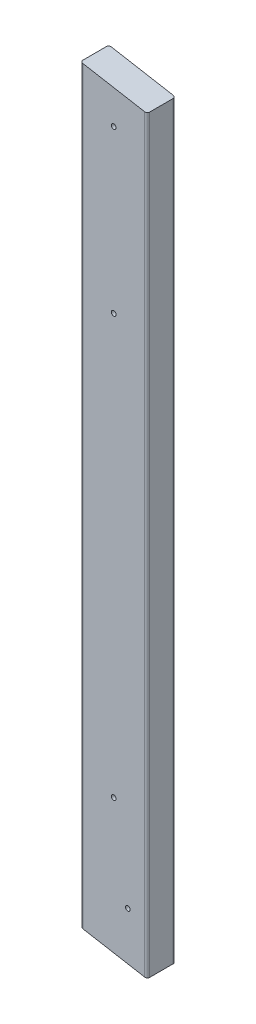
ISO-10303-21;
HEADER;
FILE_DESCRIPTION(('STEP AP214'),'2;1');
FILE_NAME('part.step','',(''),(''),'','','');
FILE_SCHEMA(('AUTOMOTIVE_DESIGN { 1 0 10303 214 1 1 1 1 }'));
ENDSEC;
DATA;
#1=APPLICATION_CONTEXT('core data for automotive mechanical design processes');
#2=APPLICATION_PROTOCOL_DEFINITION('international standard','automotive_design',2000,#1);
#3=PRODUCT_CONTEXT('',#1,'mechanical');
#4=PRODUCT('Part','Part','',(#3));
#5=PRODUCT_RELATED_PRODUCT_CATEGORY('part','',(#4));
#6=PRODUCT_DEFINITION_FORMATION('','',#4);
#7=PRODUCT_DEFINITION_CONTEXT('part definition',#1,'design');
#8=PRODUCT_DEFINITION('design','',#6,#7);
#9=PRODUCT_DEFINITION_SHAPE('','',#8);
#10=(LENGTH_UNIT() NAMED_UNIT(*) SI_UNIT(.MILLI.,.METRE.));
#11=(NAMED_UNIT(*) PLANE_ANGLE_UNIT() SI_UNIT($,.RADIAN.));
#12=(NAMED_UNIT(*) SI_UNIT($,.STERADIAN.) SOLID_ANGLE_UNIT());
#13=UNCERTAINTY_MEASURE_WITH_UNIT(LENGTH_MEASURE(1.E-05),#10,'distance_accuracy_value','');
#14=(GEOMETRIC_REPRESENTATION_CONTEXT(3) GLOBAL_UNCERTAINTY_ASSIGNED_CONTEXT((#13)) GLOBAL_UNIT_ASSIGNED_CONTEXT((#10,
#11,#12)) REPRESENTATION_CONTEXT('',''));
#15=CARTESIAN_POINT('',(0.,0.,0.));
#16=DIRECTION('',(0.,0.,1.));
#17=DIRECTION('',(1.,0.,0.));
#18=AXIS2_PLACEMENT_3D('',#15,#16,#17);
#19=CARTESIAN_POINT('',(-44.4500000000001,1016.,-19.05));
#20=DIRECTION('',(1.,0.,0.));
#21=DIRECTION('',(0.,0.,-0.999999999999999));
#22=AXIS2_PLACEMENT_3D('',#19,#20,#21);
#23=PLANE('',#22);
#24=DIRECTION('',(0.,0.,0.999999999999999));
#25=VECTOR('',#24,1.);
#26=CARTESIAN_POINT('',(-44.4500000000001,1016.,-19.05));
#27=LINE('',#26,#25);
#28=CARTESIAN_POINT('',(-44.4500000000001,1016.,-15.8749999999999));
#29=VERTEX_POINT('',#28);
#30=CARTESIAN_POINT('',(-44.4500000000001,1016.,15.8749999999999));
#31=VERTEX_POINT('',#30);
#32=EDGE_CURVE('E142',#29,#31,#27,.T.);
#33=ORIENTED_EDGE('',*,*,#32,.F.);
#34=DIRECTION('',(0.,-1.,0.));
#35=VECTOR('',#34,1.);
#36=CARTESIAN_POINT('',(-44.4500000000001,1016.,-15.8749999999999));
#37=LINE('',#36,#35);
#38=CARTESIAN_POINT('',(-44.4500000000012,15.6754685849817,-15.8749999999999));
#39=VERTEX_POINT('',#38);
#40=EDGE_CURVE('E11',#29,#39,#37,.T.);
#41=ORIENTED_EDGE('',*,*,#40,.T.);
#42=DIRECTION('',(0.,0.,0.999999999999999));
#43=VECTOR('',#42,1.);
#44=CARTESIAN_POINT('',(-44.4500000000012,15.6754685849816,-19.05));
#45=LINE('',#44,#43);
#46=CARTESIAN_POINT('',(-44.450000000001,15.6754685849817,15.8749999999999));
#47=VERTEX_POINT('',#46);
#48=EDGE_CURVE('E124',#39,#47,#45,.T.);
#49=ORIENTED_EDGE('',*,*,#48,.T.);
#50=DIRECTION('',(0.,-1.,0.));
#51=VECTOR('',#50,1.);
#52=CARTESIAN_POINT('',(-44.4500000000001,1016.,15.8749999999999));
#53=LINE('',#52,#51);
#54=EDGE_CURVE('E40',#47,#31,#53,.F.);
#55=ORIENTED_EDGE('',*,*,#54,.T.);
#56=EDGE_LOOP('',(#33,#41,#49,#55));
#57=FACE_BOUND('',#56,.T.);
#58=ADVANCED_FACE('F32',(#57),#23,.F.);
#59=CARTESIAN_POINT('',(44.449999999999,1016.,19.05));
#60=DIRECTION('',(0.,0.,-0.999999999999999));
#61=DIRECTION('',(-1.,0.,0.));
#62=AXIS2_PLACEMENT_3D('',#59,#60,#61);
#63=PLANE('',#62);
#64=CARTESIAN_POINT('',(18.7869687794762,68.7375857646206,19.05));
#65=DIRECTION('',(0.,0.,0.999999999999999));
#66=DIRECTION('',(1.,0.,0.));
#67=AXIS2_PLACEMENT_3D('',#64,#65,#66);
#68=CIRCLE('',#67,3.17499999999999);
#69=CARTESIAN_POINT('',(21.9619687794762,68.7375857646206,19.05));
#70=VERTEX_POINT('',#69);
#71=EDGE_CURVE('E330',#70,#70,#68,.T.);
#72=ORIENTED_EDGE('',*,*,#71,.F.);
#73=EDGE_LOOP('',(#72));
#74=FACE_BOUND('',#73,.T.);
#75=CARTESIAN_POINT('',(-4.44089209850063E-13,187.400991466,19.0500000000009));
#76=DIRECTION('',(0.,0.,0.999999999999999));
#77=DIRECTION('',(1.,0.,0.));
#78=AXIS2_PLACEMENT_3D('',#75,#76,#77);
#79=CIRCLE('',#78,3.17499999999999);
#80=CARTESIAN_POINT('',(3.17499999999955,187.400991466,19.0500000000009));
#81=VERTEX_POINT('',#80);
#82=EDGE_CURVE('E326',#81,#81,#79,.T.);
#83=ORIENTED_EDGE('',*,*,#82,.F.);
#84=EDGE_LOOP('',(#83));
#85=FACE_BOUND('',#84,.T.);
#86=CARTESIAN_POINT('',(-8.88178419700125E-13,747.126552809187,19.05));
#87=DIRECTION('',(0.,0.,0.999999999999999));
#88=DIRECTION('',(1.,0.,0.));
#89=AXIS2_PLACEMENT_3D('',#86,#87,#88);
#90=CIRCLE('',#89,3.17499999999999);
#91=CARTESIAN_POINT('',(3.1749999999991,747.126552809187,19.05));
#92=VERTEX_POINT('',#91);
#93=EDGE_CURVE('E320',#92,#92,#90,.T.);
#94=ORIENTED_EDGE('',*,*,#93,.F.);
#95=EDGE_LOOP('',(#94));
#96=FACE_BOUND('',#95,.T.);
#97=CARTESIAN_POINT('',(-2.22044604925031E-13,963.026552809188,19.05));
#98=DIRECTION('',(0.,0.,0.999999999999999));
#99=DIRECTION('',(1.,0.,0.));
#100=AXIS2_PLACEMENT_3D('',#97,#98,#99);
#101=CIRCLE('',#100,3.17499999999999);
#102=CARTESIAN_POINT('',(3.17499999999977,963.026552809188,19.05));
#103=VERTEX_POINT('',#102);
#104=EDGE_CURVE('E316',#103,#103,#101,.T.);
#105=ORIENTED_EDGE('',*,*,#104,.F.);
#106=EDGE_LOOP('',(#105));
#107=FACE_BOUND('',#106,.T.);
#108=DIRECTION('',(-0.98480775301221,0.173648177666924,0.));
#109=VECTOR('',#108,1.);
#110=CARTESIAN_POINT('',(-44.450000000001,15.6754685849817,19.05));
#111=LINE('',#110,#109);
#112=CARTESIAN_POINT('',(41.2749999999988,0.55983816374916,19.05));
#113=VERTEX_POINT('',#112);
#114=CARTESIAN_POINT('',(-41.2750000000004,15.1156304212324,19.05));
#115=VERTEX_POINT('',#114);
#116=EDGE_CURVE('E125',#113,#115,#111,.T.);
#117=ORIENTED_EDGE('',*,*,#116,.F.);
#118=DIRECTION('',(0.,-1.,0.));
#119=VECTOR('',#118,1.);
#120=CARTESIAN_POINT('',(41.2749999999999,1016.,19.05));
#121=LINE('',#120,#119);
#122=CARTESIAN_POINT('',(41.2749999999988,1000.88436957877,19.05));
#123=VERTEX_POINT('',#122);
#124=EDGE_CURVE('E162',#113,#123,#121,.F.);
#125=ORIENTED_EDGE('',*,*,#124,.T.);
#126=DIRECTION('',(0.984807753012209,-0.173648177666925,0.));
#127=VECTOR('',#126,1.);
#128=CARTESIAN_POINT('',(-44.4500000000001,1016.,19.05));
#129=LINE('',#128,#127);
#130=CARTESIAN_POINT('',(-41.2750000000002,1015.44016183625,19.05));
#131=VERTEX_POINT('',#130);
#132=EDGE_CURVE('E137',#131,#123,#129,.T.);
#133=ORIENTED_EDGE('',*,*,#132,.F.);
#134=DIRECTION('',(0.,-1.,0.));
#135=VECTOR('',#134,1.);
#136=CARTESIAN_POINT('',(-41.2750000000015,1016.,19.05));
#137=LINE('',#136,#135);
#138=EDGE_CURVE('E159',#131,#115,#137,.T.);
#139=ORIENTED_EDGE('',*,*,#138,.T.);
#140=EDGE_LOOP('',(#117,#125,#133,#139));
#141=FACE_BOUND('',#140,.T.);
#142=ADVANCED_FACE('F167',(#74,#85,#96,#107,#141),#63,.F.);
#143=CARTESIAN_POINT('',(44.4499999999992,1016.,-19.05));
#144=DIRECTION('',(-1.,0.,0.));
#145=DIRECTION('',(0.,0.,0.999999999999999));
#146=AXIS2_PLACEMENT_3D('',#143,#144,#145);
#147=PLANE('',#146);
#148=DIRECTION('',(0.,0.,-0.999999999999999));
#149=VECTOR('',#148,1.);
#150=CARTESIAN_POINT('',(44.449999999999,-2.22044604925031E-13,-19.05));
#151=LINE('',#150,#149);
#152=CARTESIAN_POINT('',(44.4499999999994,-2.77555756156289E-13,15.8749999999999));
#153=VERTEX_POINT('',#152);
#154=CARTESIAN_POINT('',(44.449999999999,-2.22044604925031E-13,-15.8749999999999));
#155=VERTEX_POINT('',#154);
#156=EDGE_CURVE('E127',#153,#155,#151,.T.);
#157=ORIENTED_EDGE('',*,*,#156,.T.);
#158=DIRECTION('',(0.,-1.,0.));
#159=VECTOR('',#158,1.);
#160=CARTESIAN_POINT('',(44.4499999999992,1016.,-15.8749999999999));
#161=LINE('',#160,#159);
#162=CARTESIAN_POINT('',(44.4499999999999,1000.32453141502,-15.8749999999999));
#163=VERTEX_POINT('',#162);
#164=EDGE_CURVE('E103',#155,#163,#161,.F.);
#165=ORIENTED_EDGE('',*,*,#164,.T.);
#166=DIRECTION('',(0.,0.,0.999999999999999));
#167=VECTOR('',#166,1.);
#168=CARTESIAN_POINT('',(44.4499999999999,1000.32453141502,-19.05));
#169=LINE('',#168,#167);
#170=CARTESIAN_POINT('',(44.4499999999999,1000.32453141502,15.8749999999999));
#171=VERTEX_POINT('',#170);
#172=EDGE_CURVE('E130',#163,#171,#169,.T.);
#173=ORIENTED_EDGE('',*,*,#172,.T.);
#174=DIRECTION('',(0.,-1.,0.));
#175=VECTOR('',#174,1.);
#176=CARTESIAN_POINT('',(44.449999999999,1016.,15.8749999999999));
#177=LINE('',#176,#175);
#178=EDGE_CURVE('E108',#171,#153,#177,.T.);
#179=ORIENTED_EDGE('',*,*,#178,.T.);
#180=EDGE_LOOP('',(#157,#165,#173,#179));
#181=FACE_BOUND('',#180,.T.);
#182=ADVANCED_FACE('F177',(#181),#147,.F.);
#183=CARTESIAN_POINT('',(44.4499999999992,1016.,-19.05));
#184=DIRECTION('',(0.,0.,0.999999999999999));
#185=DIRECTION('',(1.,0.,0.));
#186=AXIS2_PLACEMENT_3D('',#183,#184,#185);
#187=PLANE('',#186);
#188=CARTESIAN_POINT('',(18.7869687794762,68.7375857646206,-19.05));
#189=DIRECTION('',(0.,0.,0.999999999999999));
#190=DIRECTION('',(1.,0.,0.));
#191=AXIS2_PLACEMENT_3D('',#188,#189,#190);
#192=CIRCLE('',#191,3.17499999999998);
#193=CARTESIAN_POINT('',(21.9619687794762,68.7375857646206,-19.05));
#194=VERTEX_POINT('',#193);
#195=EDGE_CURVE('E305',#194,#194,#192,.T.);
#196=ORIENTED_EDGE('',*,*,#195,.T.);
#197=EDGE_LOOP('',(#196));
#198=FACE_BOUND('',#197,.T.);
#199=CARTESIAN_POINT('',(-4.44089209850063E-13,187.400991466,-19.0499999999991));
#200=DIRECTION('',(0.,0.,0.999999999999999));
#201=DIRECTION('',(1.,0.,0.));
#202=AXIS2_PLACEMENT_3D('',#199,#200,#201);
#203=CIRCLE('',#202,3.17499999999998);
#204=CARTESIAN_POINT('',(3.17499999999955,187.400991466,-19.0499999999991));
#205=VERTEX_POINT('',#204);
#206=EDGE_CURVE('E309',#205,#205,#203,.T.);
#207=ORIENTED_EDGE('',*,*,#206,.T.);
#208=EDGE_LOOP('',(#207));
#209=FACE_BOUND('',#208,.T.);
#210=CARTESIAN_POINT('',(-8.88178419700125E-13,747.126552809187,-19.05));
#211=DIRECTION('',(0.,0.,0.999999999999999));
#212=DIRECTION('',(1.,0.,0.));
#213=AXIS2_PLACEMENT_3D('',#210,#211,#212);
#214=CIRCLE('',#213,3.17499999999998);
#215=CARTESIAN_POINT('',(3.1749999999991,747.126552809187,-19.05));
#216=VERTEX_POINT('',#215);
#217=EDGE_CURVE('E313',#216,#216,#214,.T.);
#218=ORIENTED_EDGE('',*,*,#217,.T.);
#219=EDGE_LOOP('',(#218));
#220=FACE_BOUND('',#219,.T.);
#221=CARTESIAN_POINT('',(-2.22044604925031E-13,963.026552809188,-19.05));
#222=DIRECTION('',(0.,0.,0.999999999999999));
#223=DIRECTION('',(1.,0.,0.));
#224=AXIS2_PLACEMENT_3D('',#221,#222,#223);
#225=CIRCLE('',#224,3.17499999999998);
#226=CARTESIAN_POINT('',(3.17499999999977,963.026552809188,-19.05));
#227=VERTEX_POINT('',#226);
#228=EDGE_CURVE('E133',#227,#227,#225,.T.);
#229=ORIENTED_EDGE('',*,*,#228,.T.);
#230=EDGE_LOOP('',(#229));
#231=FACE_BOUND('',#230,.T.);
#232=DIRECTION('',(0.984807753012209,-0.173648177666925,0.));
#233=VECTOR('',#232,1.);
#234=CARTESIAN_POINT('',(-44.4500000000001,1016.,-19.05));
#235=LINE('',#234,#233);
#236=CARTESIAN_POINT('',(-41.2750000000002,1015.44016183625,-19.05));
#237=VERTEX_POINT('',#236);
#238=CARTESIAN_POINT('',(41.2749999999988,1000.88436957877,-19.05));
#239=VERTEX_POINT('',#238);
#240=EDGE_CURVE('E117',#237,#239,#235,.T.);
#241=ORIENTED_EDGE('',*,*,#240,.T.);
#242=DIRECTION('',(0.,-1.,0.));
#243=VECTOR('',#242,1.);
#244=CARTESIAN_POINT('',(41.2749999999999,1016.,-19.05));
#245=LINE('',#244,#243);
#246=CARTESIAN_POINT('',(41.2749999999988,0.559838163749049,-19.05));
#247=VERTEX_POINT('',#246);
#248=EDGE_CURVE('E102',#239,#247,#245,.T.);
#249=ORIENTED_EDGE('',*,*,#248,.T.);
#250=DIRECTION('',(-0.98480775301221,0.173648177666924,0.));
#251=VECTOR('',#250,1.);
#252=CARTESIAN_POINT('',(-44.4500000000012,15.6754685849816,-19.05));
#253=LINE('',#252,#251);
#254=CARTESIAN_POINT('',(-41.2750000000008,15.1156304212323,-19.05));
#255=VERTEX_POINT('',#254);
#256=EDGE_CURVE('E115',#247,#255,#253,.T.);
#257=ORIENTED_EDGE('',*,*,#256,.T.);
#258=DIRECTION('',(0.,-1.,0.));
#259=VECTOR('',#258,1.);
#260=CARTESIAN_POINT('',(-41.2750000000011,1016.,-19.05));
#261=LINE('',#260,#259);
#262=EDGE_CURVE('E119',#255,#237,#261,.F.);
#263=ORIENTED_EDGE('',*,*,#262,.T.);
#264=EDGE_LOOP('',(#241,#249,#257,#263));
#265=FACE_BOUND('',#264,.T.);
#266=ADVANCED_FACE('F114',(#198,#209,#220,#231,#265),#187,.F.);
#267=CARTESIAN_POINT('',(-44.4500000000012,15.6754685849816,-19.05));
#268=DIRECTION('',(0.173648177666924,0.984807753012211,0.));
#269=DIRECTION('',(-0.984807753012211,0.173648177666924,0.));
#270=AXIS2_PLACEMENT_3D('',#267,#268,#269);
#271=PLANE('',#270);
#272=ORIENTED_EDGE('',*,*,#256,.F.);
#273=CARTESIAN_POINT('',(41.2749999999988,0.55983816374916,-15.8749999999999));
#274=DIRECTION('',(0.173648177666924,0.984807753012211,0.));
#275=DIRECTION('',(0.984807753012211,-0.173648177666924,0.));
#276=AXIS2_PLACEMENT_3D('',#273,#274,#275);
#277=ELLIPSE('',#276,3.22397949273724,3.175);
#278=EDGE_CURVE('E98',#247,#155,#277,.F.);
#279=ORIENTED_EDGE('',*,*,#278,.T.);
#280=ORIENTED_EDGE('',*,*,#156,.F.);
#281=CARTESIAN_POINT('',(41.2749999999988,0.559838163749216,15.8749999999999));
#282=DIRECTION('',(0.173648177666924,0.984807753012211,0.));
#283=DIRECTION('',(0.984807753012211,-0.173648177666924,0.));
#284=AXIS2_PLACEMENT_3D('',#281,#282,#283);
#285=ELLIPSE('',#284,3.22397949273724,3.175);
#286=EDGE_CURVE('E109',#153,#113,#285,.F.);
#287=ORIENTED_EDGE('',*,*,#286,.T.);
#288=ORIENTED_EDGE('',*,*,#116,.T.);
#289=CARTESIAN_POINT('',(-41.2750000000011,15.1156304212325,15.8749999999999));
#290=DIRECTION('',(0.173648177666924,0.984807753012211,0.));
#291=DIRECTION('',(0.984807753012211,-0.173648177666924,0.));
#292=AXIS2_PLACEMENT_3D('',#289,#290,#291);
#293=ELLIPSE('',#292,3.22397949273724,3.175);
#294=EDGE_CURVE('E118',#115,#47,#293,.F.);
#295=ORIENTED_EDGE('',*,*,#294,.T.);
#296=ORIENTED_EDGE('',*,*,#48,.F.);
#297=CARTESIAN_POINT('',(-41.2750000000008,15.1156304212325,-15.8749999999999));
#298=DIRECTION('',(0.173648177666924,0.984807753012211,0.));
#299=DIRECTION('',(0.984807753012211,-0.173648177666924,0.));
#300=AXIS2_PLACEMENT_3D('',#297,#298,#299);
#301=ELLIPSE('',#300,3.22397949273724,3.175);
#302=EDGE_CURVE('E123',#39,#255,#301,.F.);
#303=ORIENTED_EDGE('',*,*,#302,.T.);
#304=EDGE_LOOP('',(#272,#279,#280,#287,#288,#295,#296,#303));
#305=FACE_BOUND('',#304,.T.);
#306=ADVANCED_FACE('F121',(#305),#271,.F.);
#307=CARTESIAN_POINT('',(-44.4500000000001,1016.,-19.05));
#308=DIRECTION('',(-0.173648177666925,-0.984807753012209,0.));
#309=DIRECTION('',(0.984807753012209,-0.173648177666925,0.));
#310=AXIS2_PLACEMENT_3D('',#307,#308,#309);
#311=PLANE('',#310);
#312=ORIENTED_EDGE('',*,*,#172,.F.);
#313=CARTESIAN_POINT('',(41.2749999999988,1000.88436957877,-15.8749999999999));
#314=DIRECTION('',(-0.173648177666925,-0.984807753012209,0.));
#315=DIRECTION('',(0.984807753012209,-0.173648177666925,0.));
#316=AXIS2_PLACEMENT_3D('',#313,#314,#315);
#317=ELLIPSE('',#316,3.22397949273724,3.175);
#318=EDGE_CURVE('E157',#163,#239,#317,.F.);
#319=ORIENTED_EDGE('',*,*,#318,.T.);
#320=ORIENTED_EDGE('',*,*,#240,.F.);
#321=CARTESIAN_POINT('',(-41.2750000000002,1015.44016183625,-15.8749999999999));
#322=DIRECTION('',(-0.173648177666925,-0.984807753012209,0.));
#323=DIRECTION('',(0.984807753012209,-0.173648177666925,0.));
#324=AXIS2_PLACEMENT_3D('',#321,#322,#323);
#325=ELLIPSE('',#324,3.22397949273724,3.175);
#326=EDGE_CURVE('E53',#237,#29,#325,.F.);
#327=ORIENTED_EDGE('',*,*,#326,.T.);
#328=ORIENTED_EDGE('',*,*,#32,.T.);
#329=CARTESIAN_POINT('',(-41.2750000000002,1015.44016183625,15.8749999999999));
#330=DIRECTION('',(-0.173648177666925,-0.984807753012209,0.));
#331=DIRECTION('',(0.984807753012209,-0.173648177666925,0.));
#332=AXIS2_PLACEMENT_3D('',#329,#330,#331);
#333=ELLIPSE('',#332,3.22397949273724,3.175);
#334=EDGE_CURVE('E152',#31,#131,#333,.F.);
#335=ORIENTED_EDGE('',*,*,#334,.T.);
#336=ORIENTED_EDGE('',*,*,#132,.T.);
#337=CARTESIAN_POINT('',(41.2749999999988,1000.88436957877,15.8749999999999));
#338=DIRECTION('',(-0.173648177666925,-0.984807753012209,0.));
#339=DIRECTION('',(0.984807753012209,-0.173648177666925,0.));
#340=AXIS2_PLACEMENT_3D('',#337,#338,#339);
#341=ELLIPSE('',#340,3.22397949273724,3.175);
#342=EDGE_CURVE('E155',#123,#171,#341,.F.);
#343=ORIENTED_EDGE('',*,*,#342,.T.);
#344=EDGE_LOOP('',(#312,#319,#320,#327,#328,#335,#336,#343));
#345=FACE_BOUND('',#344,.T.);
#346=ADVANCED_FACE('F172',(#345),#311,.F.);
#347=CARTESIAN_POINT('',(-2.22044604925031E-13,963.026552809188,19.05));
#348=DIRECTION('',(0.,0.,0.999999999999999));
#349=DIRECTION('',(1.,0.,0.));
#350=AXIS2_PLACEMENT_3D('',#347,#348,#349);
#351=CYLINDRICAL_SURFACE('',#350,3.17499999999999);
#352=CARTESIAN_POINT('',(3.17499999999977,963.026552809188,-19.05));
#353=CARTESIAN_POINT('',(3.17499999999977,963.026552809188,-18.653125));
#354=CARTESIAN_POINT('',(3.17499999999977,963.026552809188,-18.25625));
#355=CARTESIAN_POINT('',(3.17499999999977,963.026552809188,-17.4625));
#356=CARTESIAN_POINT('',(3.17499999999977,963.026552809188,-17.065625));
#357=CARTESIAN_POINT('',(3.17499999999977,963.026552809188,-16.271875));
#358=CARTESIAN_POINT('',(3.17499999999977,963.026552809188,-15.875));
#359=CARTESIAN_POINT('',(3.17499999999977,963.026552809188,-15.08125));
#360=CARTESIAN_POINT('',(3.17499999999977,963.026552809188,-14.684375));
#361=CARTESIAN_POINT('',(3.17499999999977,963.026552809188,-13.890625));
#362=CARTESIAN_POINT('',(3.17499999999977,963.026552809188,-13.49375));
#363=CARTESIAN_POINT('',(3.17499999999977,963.026552809188,-12.7));
#364=CARTESIAN_POINT('',(3.17499999999977,963.026552809188,-12.303125));
#365=CARTESIAN_POINT('',(3.17499999999977,963.026552809188,-11.509375));
#366=CARTESIAN_POINT('',(3.17499999999977,963.026552809188,-11.1125));
#367=CARTESIAN_POINT('',(3.17499999999977,963.026552809188,-10.31875));
#368=CARTESIAN_POINT('',(3.17499999999977,963.026552809188,-9.921875));
#369=CARTESIAN_POINT('',(3.17499999999977,963.026552809188,-9.128125));
#370=CARTESIAN_POINT('',(3.17499999999977,963.026552809188,-8.73125));
#371=CARTESIAN_POINT('',(3.17499999999977,963.026552809188,-7.93749999999999));
#372=CARTESIAN_POINT('',(3.17499999999977,963.026552809188,-7.540625));
#373=CARTESIAN_POINT('',(3.17499999999977,963.026552809188,-6.746875));
#374=CARTESIAN_POINT('',(3.17499999999977,963.026552809188,-6.35));
#375=CARTESIAN_POINT('',(3.17499999999977,963.026552809188,-5.55625));
#376=CARTESIAN_POINT('',(3.17499999999977,963.026552809188,-5.159375));
#377=CARTESIAN_POINT('',(3.17499999999977,963.026552809188,-4.365625));
#378=CARTESIAN_POINT('',(3.17499999999977,963.026552809188,-3.96875));
#379=CARTESIAN_POINT('',(3.17499999999977,963.026552809188,-3.175));
#380=CARTESIAN_POINT('',(3.17499999999977,963.026552809188,-2.778125));
#381=CARTESIAN_POINT('',(3.17499999999977,963.026552809188,-1.984375));
#382=CARTESIAN_POINT('',(3.17499999999977,963.026552809188,-1.5875));
#383=CARTESIAN_POINT('',(3.17499999999977,963.026552809188,-0.793749999999995));
#384=CARTESIAN_POINT('',(3.17499999999977,963.026552809188,-0.396874999999996));
#385=CARTESIAN_POINT('',(3.17499999999977,963.026552809188,0.396875000000004));
#386=CARTESIAN_POINT('',(3.17499999999977,963.026552809188,0.793750000000004));
#387=CARTESIAN_POINT('',(3.17499999999977,963.026552809188,1.5875));
#388=CARTESIAN_POINT('',(3.17499999999977,963.026552809188,1.984375));
#389=CARTESIAN_POINT('',(3.17499999999977,963.026552809188,2.77812500000001));
#390=CARTESIAN_POINT('',(3.17499999999977,963.026552809188,3.17500000000001));
#391=CARTESIAN_POINT('',(3.17499999999977,963.026552809188,3.96875000000001));
#392=CARTESIAN_POINT('',(3.17499999999977,963.026552809188,4.36562500000001));
#393=CARTESIAN_POINT('',(3.17499999999977,963.026552809188,5.15937500000001));
#394=CARTESIAN_POINT('',(3.17499999999977,963.026552809188,5.55625000000001));
#395=CARTESIAN_POINT('',(3.17499999999977,963.026552809188,6.35000000000001));
#396=CARTESIAN_POINT('',(3.17499999999977,963.026552809188,6.74687500000001));
#397=CARTESIAN_POINT('',(3.17499999999977,963.026552809188,7.54062500000001));
#398=CARTESIAN_POINT('',(3.17499999999977,963.026552809188,7.93750000000001));
#399=CARTESIAN_POINT('',(3.17499999999977,963.026552809188,8.73125000000001));
#400=CARTESIAN_POINT('',(3.17499999999977,963.026552809188,9.12812500000001));
#401=CARTESIAN_POINT('',(3.17499999999977,963.026552809188,9.92187500000001));
#402=CARTESIAN_POINT('',(3.17499999999977,963.026552809188,10.31875));
#403=CARTESIAN_POINT('',(3.17499999999977,963.026552809188,11.1125));
#404=CARTESIAN_POINT('',(3.17499999999977,963.026552809188,11.509375));
#405=CARTESIAN_POINT('',(3.17499999999977,963.026552809188,12.303125));
#406=CARTESIAN_POINT('',(3.17499999999977,963.026552809188,12.7));
#407=CARTESIAN_POINT('',(3.17499999999977,963.026552809188,13.49375));
#408=CARTESIAN_POINT('',(3.17499999999977,963.026552809188,13.890625));
#409=CARTESIAN_POINT('',(3.17499999999977,963.026552809188,14.684375));
#410=CARTESIAN_POINT('',(3.17499999999977,963.026552809188,15.08125));
#411=CARTESIAN_POINT('',(3.17499999999977,963.026552809188,15.875));
#412=CARTESIAN_POINT('',(3.17499999999977,963.026552809188,16.271875));
#413=CARTESIAN_POINT('',(3.17499999999977,963.026552809188,17.065625));
#414=CARTESIAN_POINT('',(3.17499999999977,963.026552809188,17.4625));
#415=CARTESIAN_POINT('',(3.17499999999977,963.026552809188,18.25625));
#416=CARTESIAN_POINT('',(3.17499999999977,963.026552809188,18.653125));
#417=CARTESIAN_POINT('',(3.17499999999977,963.026552809188,19.05));
#418=B_SPLINE_CURVE_WITH_KNOTS('',3,(#352,#353,#354,#355,#356,#357,#358,#359,#360,#361,#362,
#363,#364,#365,#366,#367,#368,#369,#370,#371,#372,#373,#374,#375,#376,#377,#378,#379,#380,#381,
#382,#383,#384,#385,#386,#387,#388,#389,#390,#391,#392,#393,#394,#395,#396,#397,#398,#399,#400,
#401,#402,#403,#404,#405,#406,#407,#408,#409,#410,#411,#412,#413,#414,#415,#416,#417),
.UNSPECIFIED.,.F.,.F.,(4,2,2,2,2,2,2,2,2,2,2,2,2,2,2,2,2,2,2,2,2,2,2,2,2,2,2,2,2,2,2,2,4),(0.,
1.190625,2.38125,3.57187500000001,4.7625,5.953125,7.14375,8.334375,9.52500000000001,10.715625,
11.90625,13.096875,14.2875,15.478125,16.66875,17.859375,19.05,20.240625,21.43125,22.621875,
23.8125,25.003125,26.19375,27.384375,28.575,29.765625,30.95625,32.146875,33.3375,34.528125,
35.71875,36.909375,38.1),.UNSPECIFIED.);
#419=EDGE_CURVE('BSEAM245',#227,#103,#418,.T.);
#420=ORIENTED_EDGE('',*,*,#228,.F.);
#421=ORIENTED_EDGE('',*,*,#104,.T.);
#422=ORIENTED_EDGE('',*,*,#419,.T.);
#423=ORIENTED_EDGE('',*,*,#419,.F.);
#424=EDGE_LOOP('',(#420,#422,#421,#423));
#425=FACE_BOUND('',#424,.T.);
#426=ADVANCED_FACE('F245',(#425),#351,.F.);
#427=CARTESIAN_POINT('',(-8.88178419700125E-13,747.126552809187,19.05));
#428=DIRECTION('',(0.,0.,0.999999999999999));
#429=DIRECTION('',(1.,0.,0.));
#430=AXIS2_PLACEMENT_3D('',#427,#428,#429);
#431=CYLINDRICAL_SURFACE('',#430,3.17499999999999);
#432=CARTESIAN_POINT('',(3.1749999999991,747.126552809187,-19.05));
#433=CARTESIAN_POINT('',(3.1749999999991,747.126552809187,-18.653125));
#434=CARTESIAN_POINT('',(3.1749999999991,747.126552809187,-18.25625));
#435=CARTESIAN_POINT('',(3.1749999999991,747.126552809187,-17.4625));
#436=CARTESIAN_POINT('',(3.1749999999991,747.126552809187,-17.065625));
#437=CARTESIAN_POINT('',(3.1749999999991,747.126552809187,-16.271875));
#438=CARTESIAN_POINT('',(3.1749999999991,747.126552809187,-15.875));
#439=CARTESIAN_POINT('',(3.1749999999991,747.126552809187,-15.08125));
#440=CARTESIAN_POINT('',(3.1749999999991,747.126552809187,-14.684375));
#441=CARTESIAN_POINT('',(3.1749999999991,747.126552809187,-13.890625));
#442=CARTESIAN_POINT('',(3.1749999999991,747.126552809187,-13.49375));
#443=CARTESIAN_POINT('',(3.1749999999991,747.126552809187,-12.7));
#444=CARTESIAN_POINT('',(3.1749999999991,747.126552809187,-12.303125));
#445=CARTESIAN_POINT('',(3.1749999999991,747.126552809187,-11.509375));
#446=CARTESIAN_POINT('',(3.1749999999991,747.126552809187,-11.1125));
#447=CARTESIAN_POINT('',(3.1749999999991,747.126552809187,-10.31875));
#448=CARTESIAN_POINT('',(3.1749999999991,747.126552809187,-9.921875));
#449=CARTESIAN_POINT('',(3.1749999999991,747.126552809187,-9.128125));
#450=CARTESIAN_POINT('',(3.1749999999991,747.126552809187,-8.73125));
#451=CARTESIAN_POINT('',(3.1749999999991,747.126552809187,-7.93749999999999));
#452=CARTESIAN_POINT('',(3.1749999999991,747.126552809187,-7.540625));
#453=CARTESIAN_POINT('',(3.1749999999991,747.126552809187,-6.746875));
#454=CARTESIAN_POINT('',(3.1749999999991,747.126552809187,-6.35));
#455=CARTESIAN_POINT('',(3.1749999999991,747.126552809187,-5.55625));
#456=CARTESIAN_POINT('',(3.1749999999991,747.126552809187,-5.159375));
#457=CARTESIAN_POINT('',(3.1749999999991,747.126552809187,-4.365625));
#458=CARTESIAN_POINT('',(3.1749999999991,747.126552809187,-3.96875));
#459=CARTESIAN_POINT('',(3.1749999999991,747.126552809187,-3.175));
#460=CARTESIAN_POINT('',(3.1749999999991,747.126552809187,-2.778125));
#461=CARTESIAN_POINT('',(3.1749999999991,747.126552809187,-1.984375));
#462=CARTESIAN_POINT('',(3.1749999999991,747.126552809187,-1.5875));
#463=CARTESIAN_POINT('',(3.1749999999991,747.126552809187,-0.793749999999995));
#464=CARTESIAN_POINT('',(3.1749999999991,747.126552809187,-0.396874999999996));
#465=CARTESIAN_POINT('',(3.1749999999991,747.126552809187,0.396875000000004));
#466=CARTESIAN_POINT('',(3.1749999999991,747.126552809187,0.793750000000004));
#467=CARTESIAN_POINT('',(3.1749999999991,747.126552809187,1.5875));
#468=CARTESIAN_POINT('',(3.1749999999991,747.126552809187,1.984375));
#469=CARTESIAN_POINT('',(3.1749999999991,747.126552809187,2.77812500000001));
#470=CARTESIAN_POINT('',(3.1749999999991,747.126552809187,3.17500000000001));
#471=CARTESIAN_POINT('',(3.1749999999991,747.126552809187,3.96875000000001));
#472=CARTESIAN_POINT('',(3.1749999999991,747.126552809187,4.36562500000001));
#473=CARTESIAN_POINT('',(3.1749999999991,747.126552809187,5.15937500000001));
#474=CARTESIAN_POINT('',(3.1749999999991,747.126552809187,5.55625000000001));
#475=CARTESIAN_POINT('',(3.1749999999991,747.126552809187,6.35000000000001));
#476=CARTESIAN_POINT('',(3.1749999999991,747.126552809187,6.74687500000001));
#477=CARTESIAN_POINT('',(3.1749999999991,747.126552809187,7.54062500000001));
#478=CARTESIAN_POINT('',(3.1749999999991,747.126552809187,7.93750000000001));
#479=CARTESIAN_POINT('',(3.1749999999991,747.126552809187,8.73125000000001));
#480=CARTESIAN_POINT('',(3.1749999999991,747.126552809187,9.12812500000001));
#481=CARTESIAN_POINT('',(3.1749999999991,747.126552809187,9.92187500000001));
#482=CARTESIAN_POINT('',(3.1749999999991,747.126552809187,10.31875));
#483=CARTESIAN_POINT('',(3.1749999999991,747.126552809187,11.1125));
#484=CARTESIAN_POINT('',(3.1749999999991,747.126552809187,11.509375));
#485=CARTESIAN_POINT('',(3.1749999999991,747.126552809187,12.303125));
#486=CARTESIAN_POINT('',(3.1749999999991,747.126552809187,12.7));
#487=CARTESIAN_POINT('',(3.1749999999991,747.126552809187,13.49375));
#488=CARTESIAN_POINT('',(3.1749999999991,747.126552809187,13.890625));
#489=CARTESIAN_POINT('',(3.1749999999991,747.126552809187,14.684375));
#490=CARTESIAN_POINT('',(3.1749999999991,747.126552809187,15.08125));
#491=CARTESIAN_POINT('',(3.1749999999991,747.126552809187,15.875));
#492=CARTESIAN_POINT('',(3.1749999999991,747.126552809187,16.271875));
#493=CARTESIAN_POINT('',(3.1749999999991,747.126552809187,17.065625));
#494=CARTESIAN_POINT('',(3.1749999999991,747.126552809187,17.4625));
#495=CARTESIAN_POINT('',(3.1749999999991,747.126552809187,18.25625));
#496=CARTESIAN_POINT('',(3.1749999999991,747.126552809187,18.653125));
#497=CARTESIAN_POINT('',(3.1749999999991,747.126552809187,19.05));
#498=B_SPLINE_CURVE_WITH_KNOTS('',3,(#432,#433,#434,#435,#436,#437,#438,#439,#440,#441,#442,
#443,#444,#445,#446,#447,#448,#449,#450,#451,#452,#453,#454,#455,#456,#457,#458,#459,#460,#461,
#462,#463,#464,#465,#466,#467,#468,#469,#470,#471,#472,#473,#474,#475,#476,#477,#478,#479,#480,
#481,#482,#483,#484,#485,#486,#487,#488,#489,#490,#491,#492,#493,#494,#495,#496,#497),
.UNSPECIFIED.,.F.,.F.,(4,2,2,2,2,2,2,2,2,2,2,2,2,2,2,2,2,2,2,2,2,2,2,2,2,2,2,2,2,2,2,2,4),(0.,
1.190625,2.38125,3.57187500000001,4.7625,5.953125,7.14375,8.334375,9.52500000000001,10.715625,
11.90625,13.096875,14.2875,15.478125,16.66875,17.859375,19.05,20.240625,21.43125,22.621875,
23.8125,25.003125,26.19375,27.384375,28.575,29.765625,30.95625,32.146875,33.3375,34.528125,
35.71875,36.909375,38.1),.UNSPECIFIED.);
#499=EDGE_CURVE('BSEAM236',#216,#92,#498,.T.);
#500=ORIENTED_EDGE('',*,*,#217,.F.);
#501=ORIENTED_EDGE('',*,*,#93,.T.);
#502=ORIENTED_EDGE('',*,*,#499,.T.);
#503=ORIENTED_EDGE('',*,*,#499,.F.);
#504=EDGE_LOOP('',(#500,#502,#501,#503));
#505=FACE_BOUND('',#504,.T.);
#506=ADVANCED_FACE('F236',(#505),#431,.F.);
#507=CARTESIAN_POINT('',(-4.44089209850063E-13,187.400991466,19.0500000000009));
#508=DIRECTION('',(0.,0.,0.999999999999999));
#509=DIRECTION('',(1.,0.,0.));
#510=AXIS2_PLACEMENT_3D('',#507,#508,#509);
#511=CYLINDRICAL_SURFACE('',#510,3.17499999999999);
#512=CARTESIAN_POINT('',(3.17499999999955,187.400991466,-19.0499999999991));
#513=CARTESIAN_POINT('',(3.17499999999955,187.400991466,-18.6531249999991));
#514=CARTESIAN_POINT('',(3.17499999999955,187.400991466,-18.2562499999991));
#515=CARTESIAN_POINT('',(3.17499999999955,187.400991466,-17.4624999999991));
#516=CARTESIAN_POINT('',(3.17499999999955,187.400991466,-17.0656249999991));
#517=CARTESIAN_POINT('',(3.17499999999955,187.400991466,-16.2718749999991));
#518=CARTESIAN_POINT('',(3.17499999999955,187.400991466,-15.8749999999991));
#519=CARTESIAN_POINT('',(3.17499999999955,187.400991466,-15.0812499999991));
#520=CARTESIAN_POINT('',(3.17499999999955,187.400991466,-14.6843749999991));
#521=CARTESIAN_POINT('',(3.17499999999955,187.400991466,-13.8906249999991));
#522=CARTESIAN_POINT('',(3.17499999999955,187.400991466,-13.4937499999991));
#523=CARTESIAN_POINT('',(3.17499999999955,187.400991466,-12.6999999999991));
#524=CARTESIAN_POINT('',(3.17499999999955,187.400991466,-12.3031249999991));
#525=CARTESIAN_POINT('',(3.17499999999955,187.400991466,-11.5093749999991));
#526=CARTESIAN_POINT('',(3.17499999999955,187.400991466,-11.1124999999991));
#527=CARTESIAN_POINT('',(3.17499999999955,187.400991466,-10.3187499999991));
#528=CARTESIAN_POINT('',(3.17499999999955,187.400991466,-9.92187499999911));
#529=CARTESIAN_POINT('',(3.17499999999955,187.400991466,-9.12812499999911));
#530=CARTESIAN_POINT('',(3.17499999999955,187.400991466,-8.73124999999911));
#531=CARTESIAN_POINT('',(3.17499999999955,187.400991466,-7.93749999999911));
#532=CARTESIAN_POINT('',(3.17499999999955,187.400991466,-7.54062499999911));
#533=CARTESIAN_POINT('',(3.17499999999955,187.400991466,-6.74687499999911));
#534=CARTESIAN_POINT('',(3.17499999999955,187.400991466,-6.34999999999911));
#535=CARTESIAN_POINT('',(3.17499999999955,187.400991466,-5.55624999999911));
#536=CARTESIAN_POINT('',(3.17499999999955,187.400991466,-5.15937499999911));
#537=CARTESIAN_POINT('',(3.17499999999955,187.400991466,-4.36562499999911));
#538=CARTESIAN_POINT('',(3.17499999999955,187.400991466,-3.96874999999911));
#539=CARTESIAN_POINT('',(3.17499999999955,187.400991466,-3.17499999999911));
#540=CARTESIAN_POINT('',(3.17499999999955,187.400991466,-2.77812499999911));
#541=CARTESIAN_POINT('',(3.17499999999955,187.400991466,-1.98437499999911));
#542=CARTESIAN_POINT('',(3.17499999999955,187.400991466,-1.58749999999911));
#543=CARTESIAN_POINT('',(3.17499999999955,187.400991466,-0.793749999999107));
#544=CARTESIAN_POINT('',(3.17499999999955,187.400991466,-0.396874999999107));
#545=CARTESIAN_POINT('',(3.17499999999955,187.400991466,0.396875000000892));
#546=CARTESIAN_POINT('',(3.17499999999955,187.400991466,0.793750000000892));
#547=CARTESIAN_POINT('',(3.17499999999955,187.400991466,1.58750000000089));
#548=CARTESIAN_POINT('',(3.17499999999955,187.400991466,1.98437500000089));
#549=CARTESIAN_POINT('',(3.17499999999955,187.400991466,2.77812500000089));
#550=CARTESIAN_POINT('',(3.17499999999955,187.400991466,3.17500000000089));
#551=CARTESIAN_POINT('',(3.17499999999955,187.400991466,3.96875000000089));
#552=CARTESIAN_POINT('',(3.17499999999955,187.400991466,4.3656250000009));
#553=CARTESIAN_POINT('',(3.17499999999955,187.400991466,5.1593750000009));
#554=CARTESIAN_POINT('',(3.17499999999955,187.400991466,5.5562500000009));
#555=CARTESIAN_POINT('',(3.17499999999955,187.400991466,6.35000000000089));
#556=CARTESIAN_POINT('',(3.17499999999955,187.400991466,6.74687500000089));
#557=CARTESIAN_POINT('',(3.17499999999955,187.400991466,7.54062500000089));
#558=CARTESIAN_POINT('',(3.17499999999955,187.400991466,7.9375000000009));
#559=CARTESIAN_POINT('',(3.17499999999955,187.400991466,8.7312500000009));
#560=CARTESIAN_POINT('',(3.17499999999955,187.400991466,9.1281250000009));
#561=CARTESIAN_POINT('',(3.17499999999955,187.400991466,9.9218750000009));
#562=CARTESIAN_POINT('',(3.17499999999955,187.400991466,10.3187500000009));
#563=CARTESIAN_POINT('',(3.17499999999955,187.400991466,11.1125000000009));
#564=CARTESIAN_POINT('',(3.17499999999955,187.400991466,11.5093750000009));
#565=CARTESIAN_POINT('',(3.17499999999955,187.400991466,12.3031250000009));
#566=CARTESIAN_POINT('',(3.17499999999955,187.400991466,12.7000000000009));
#567=CARTESIAN_POINT('',(3.17499999999955,187.400991466,13.4937500000009));
#568=CARTESIAN_POINT('',(3.17499999999955,187.400991466,13.8906250000009));
#569=CARTESIAN_POINT('',(3.17499999999955,187.400991466,14.6843750000009));
#570=CARTESIAN_POINT('',(3.17499999999955,187.400991466,15.0812500000009));
#571=CARTESIAN_POINT('',(3.17499999999955,187.400991466,15.8750000000009));
#572=CARTESIAN_POINT('',(3.17499999999955,187.400991466,16.2718750000009));
#573=CARTESIAN_POINT('',(3.17499999999955,187.400991466,17.0656250000009));
#574=CARTESIAN_POINT('',(3.17499999999955,187.400991466,17.4625000000009));
#575=CARTESIAN_POINT('',(3.17499999999955,187.400991466,18.2562500000009));
#576=CARTESIAN_POINT('',(3.17499999999955,187.400991466,18.6531250000009));
#577=CARTESIAN_POINT('',(3.17499999999955,187.400991466,19.0500000000009));
#578=B_SPLINE_CURVE_WITH_KNOTS('',3,(#512,#513,#514,#515,#516,#517,#518,#519,#520,#521,#522,
#523,#524,#525,#526,#527,#528,#529,#530,#531,#532,#533,#534,#535,#536,#537,#538,#539,#540,#541,
#542,#543,#544,#545,#546,#547,#548,#549,#550,#551,#552,#553,#554,#555,#556,#557,#558,#559,#560,
#561,#562,#563,#564,#565,#566,#567,#568,#569,#570,#571,#572,#573,#574,#575,#576,#577),
.UNSPECIFIED.,.F.,.F.,(4,2,2,2,2,2,2,2,2,2,2,2,2,2,2,2,2,2,2,2,2,2,2,2,2,2,2,2,2,2,2,2,4),(0.,
1.190625,2.38125,3.57187500000001,4.7625,5.953125,7.14375,8.334375,9.52500000000001,10.715625,
11.90625,13.096875,14.2875,15.478125,16.66875,17.859375,19.05,20.240625,21.43125,22.621875,
23.8125,25.003125,26.19375,27.384375,28.575,29.765625,30.95625,32.146875,33.3375,34.528125,
35.71875,36.909375,38.1),.UNSPECIFIED.);
#579=EDGE_CURVE('BSEAM227',#205,#81,#578,.T.);
#580=ORIENTED_EDGE('',*,*,#206,.F.);
#581=ORIENTED_EDGE('',*,*,#82,.T.);
#582=ORIENTED_EDGE('',*,*,#579,.T.);
#583=ORIENTED_EDGE('',*,*,#579,.F.);
#584=EDGE_LOOP('',(#580,#582,#581,#583));
#585=FACE_BOUND('',#584,.T.);
#586=ADVANCED_FACE('F227',(#585),#511,.F.);
#587=CARTESIAN_POINT('',(18.7869687794762,68.7375857646206,19.05));
#588=DIRECTION('',(0.,0.,0.999999999999999));
#589=DIRECTION('',(1.,0.,0.));
#590=AXIS2_PLACEMENT_3D('',#587,#588,#589);
#591=CYLINDRICAL_SURFACE('',#590,3.17499999999999);
#592=CARTESIAN_POINT('',(21.9619687794762,68.7375857646206,-19.05));
#593=CARTESIAN_POINT('',(21.9619687794762,68.7375857646206,-18.653125));
#594=CARTESIAN_POINT('',(21.9619687794762,68.7375857646206,-18.25625));
#595=CARTESIAN_POINT('',(21.9619687794762,68.7375857646206,-17.4625));
#596=CARTESIAN_POINT('',(21.9619687794762,68.7375857646206,-17.065625));
#597=CARTESIAN_POINT('',(21.9619687794762,68.7375857646206,-16.271875));
#598=CARTESIAN_POINT('',(21.9619687794762,68.7375857646206,-15.875));
#599=CARTESIAN_POINT('',(21.9619687794762,68.7375857646206,-15.08125));
#600=CARTESIAN_POINT('',(21.9619687794762,68.7375857646206,-14.684375));
#601=CARTESIAN_POINT('',(21.9619687794762,68.7375857646206,-13.890625));
#602=CARTESIAN_POINT('',(21.9619687794762,68.7375857646206,-13.49375));
#603=CARTESIAN_POINT('',(21.9619687794762,68.7375857646206,-12.7));
#604=CARTESIAN_POINT('',(21.9619687794762,68.7375857646206,-12.303125));
#605=CARTESIAN_POINT('',(21.9619687794762,68.7375857646206,-11.509375));
#606=CARTESIAN_POINT('',(21.9619687794762,68.7375857646206,-11.1125));
#607=CARTESIAN_POINT('',(21.9619687794762,68.7375857646206,-10.31875));
#608=CARTESIAN_POINT('',(21.9619687794762,68.7375857646206,-9.921875));
#609=CARTESIAN_POINT('',(21.9619687794762,68.7375857646206,-9.128125));
#610=CARTESIAN_POINT('',(21.9619687794762,68.7375857646206,-8.73125));
#611=CARTESIAN_POINT('',(21.9619687794762,68.7375857646206,-7.93749999999999));
#612=CARTESIAN_POINT('',(21.9619687794762,68.7375857646206,-7.540625));
#613=CARTESIAN_POINT('',(21.9619687794762,68.7375857646206,-6.746875));
#614=CARTESIAN_POINT('',(21.9619687794762,68.7375857646206,-6.35));
#615=CARTESIAN_POINT('',(21.9619687794762,68.7375857646206,-5.55625));
#616=CARTESIAN_POINT('',(21.9619687794762,68.7375857646206,-5.159375));
#617=CARTESIAN_POINT('',(21.9619687794762,68.7375857646206,-4.365625));
#618=CARTESIAN_POINT('',(21.9619687794762,68.7375857646206,-3.96875));
#619=CARTESIAN_POINT('',(21.9619687794762,68.7375857646206,-3.175));
#620=CARTESIAN_POINT('',(21.9619687794762,68.7375857646206,-2.778125));
#621=CARTESIAN_POINT('',(21.9619687794762,68.7375857646206,-1.984375));
#622=CARTESIAN_POINT('',(21.9619687794762,68.7375857646206,-1.5875));
#623=CARTESIAN_POINT('',(21.9619687794762,68.7375857646206,-0.793749999999995));
#624=CARTESIAN_POINT('',(21.9619687794762,68.7375857646206,-0.396874999999996));
#625=CARTESIAN_POINT('',(21.9619687794762,68.7375857646206,0.396875000000004));
#626=CARTESIAN_POINT('',(21.9619687794762,68.7375857646206,0.793750000000004));
#627=CARTESIAN_POINT('',(21.9619687794762,68.7375857646206,1.5875));
#628=CARTESIAN_POINT('',(21.9619687794762,68.7375857646206,1.984375));
#629=CARTESIAN_POINT('',(21.9619687794762,68.7375857646206,2.77812500000001));
#630=CARTESIAN_POINT('',(21.9619687794762,68.7375857646206,3.17500000000001));
#631=CARTESIAN_POINT('',(21.9619687794762,68.7375857646206,3.96875000000001));
#632=CARTESIAN_POINT('',(21.9619687794762,68.7375857646206,4.36562500000001));
#633=CARTESIAN_POINT('',(21.9619687794762,68.7375857646206,5.15937500000001));
#634=CARTESIAN_POINT('',(21.9619687794762,68.7375857646206,5.55625000000001));
#635=CARTESIAN_POINT('',(21.9619687794762,68.7375857646206,6.35000000000001));
#636=CARTESIAN_POINT('',(21.9619687794762,68.7375857646206,6.74687500000001));
#637=CARTESIAN_POINT('',(21.9619687794762,68.7375857646206,7.54062500000001));
#638=CARTESIAN_POINT('',(21.9619687794762,68.7375857646206,7.93750000000001));
#639=CARTESIAN_POINT('',(21.9619687794762,68.7375857646206,8.73125000000001));
#640=CARTESIAN_POINT('',(21.9619687794762,68.7375857646206,9.12812500000001));
#641=CARTESIAN_POINT('',(21.9619687794762,68.7375857646206,9.92187500000001));
#642=CARTESIAN_POINT('',(21.9619687794762,68.7375857646206,10.31875));
#643=CARTESIAN_POINT('',(21.9619687794762,68.7375857646206,11.1125));
#644=CARTESIAN_POINT('',(21.9619687794762,68.7375857646206,11.509375));
#645=CARTESIAN_POINT('',(21.9619687794762,68.7375857646206,12.303125));
#646=CARTESIAN_POINT('',(21.9619687794762,68.7375857646206,12.7));
#647=CARTESIAN_POINT('',(21.9619687794762,68.7375857646206,13.49375));
#648=CARTESIAN_POINT('',(21.9619687794762,68.7375857646206,13.890625));
#649=CARTESIAN_POINT('',(21.9619687794762,68.7375857646206,14.684375));
#650=CARTESIAN_POINT('',(21.9619687794762,68.7375857646206,15.08125));
#651=CARTESIAN_POINT('',(21.9619687794762,68.7375857646206,15.875));
#652=CARTESIAN_POINT('',(21.9619687794762,68.7375857646206,16.271875));
#653=CARTESIAN_POINT('',(21.9619687794762,68.7375857646206,17.065625));
#654=CARTESIAN_POINT('',(21.9619687794762,68.7375857646206,17.4625));
#655=CARTESIAN_POINT('',(21.9619687794762,68.7375857646206,18.25625));
#656=CARTESIAN_POINT('',(21.9619687794762,68.7375857646206,18.653125));
#657=CARTESIAN_POINT('',(21.9619687794762,68.7375857646206,19.05));
#658=B_SPLINE_CURVE_WITH_KNOTS('',3,(#592,#593,#594,#595,#596,#597,#598,#599,#600,#601,#602,
#603,#604,#605,#606,#607,#608,#609,#610,#611,#612,#613,#614,#615,#616,#617,#618,#619,#620,#621,
#622,#623,#624,#625,#626,#627,#628,#629,#630,#631,#632,#633,#634,#635,#636,#637,#638,#639,#640,
#641,#642,#643,#644,#645,#646,#647,#648,#649,#650,#651,#652,#653,#654,#655,#656,#657),
.UNSPECIFIED.,.F.,.F.,(4,2,2,2,2,2,2,2,2,2,2,2,2,2,2,2,2,2,2,2,2,2,2,2,2,2,2,2,2,2,2,2,4),(0.,
1.190625,2.38125,3.57187500000001,4.7625,5.953125,7.14375,8.334375,9.52500000000001,10.715625,
11.90625,13.096875,14.2875,15.478125,16.66875,17.859375,19.05,20.240625,21.43125,22.621875,
23.8125,25.003125,26.19375,27.384375,28.575,29.765625,30.95625,32.146875,33.3375,34.528125,
35.71875,36.909375,38.1),.UNSPECIFIED.);
#659=EDGE_CURVE('BSEAM197',#194,#70,#658,.T.);
#660=ORIENTED_EDGE('',*,*,#195,.F.);
#661=ORIENTED_EDGE('',*,*,#71,.T.);
#662=ORIENTED_EDGE('',*,*,#659,.T.);
#663=ORIENTED_EDGE('',*,*,#659,.F.);
#664=EDGE_LOOP('',(#660,#662,#661,#663));
#665=FACE_BOUND('',#664,.T.);
#666=ADVANCED_FACE('F197',(#665),#591,.F.);
#667=CARTESIAN_POINT('',(41.2749999999999,1016.,-15.8749999999999));
#668=DIRECTION('',(0.,-1.,0.));
#669=DIRECTION('',(0.,0.,-0.999999999999999));
#670=AXIS2_PLACEMENT_3D('',#667,#668,#669);
#671=CYLINDRICAL_SURFACE('',#670,3.175);
#672=ORIENTED_EDGE('',*,*,#318,.F.);
#673=ORIENTED_EDGE('',*,*,#164,.F.);
#674=ORIENTED_EDGE('',*,*,#278,.F.);
#675=ORIENTED_EDGE('',*,*,#248,.F.);
#676=EDGE_LOOP('',(#672,#673,#674,#675));
#677=FACE_BOUND('',#676,.T.);
#678=ADVANCED_FACE('F101',(#677),#671,.T.);
#679=CARTESIAN_POINT('',(41.2749999999999,1016.,15.8749999999999));
#680=DIRECTION('',(0.,-1.,0.));
#681=DIRECTION('',(0.,0.,-0.999999999999999));
#682=AXIS2_PLACEMENT_3D('',#679,#680,#681);
#683=CYLINDRICAL_SURFACE('',#682,3.175);
#684=ORIENTED_EDGE('',*,*,#342,.F.);
#685=ORIENTED_EDGE('',*,*,#124,.F.);
#686=ORIENTED_EDGE('',*,*,#286,.F.);
#687=ORIENTED_EDGE('',*,*,#178,.F.);
#688=EDGE_LOOP('',(#684,#685,#686,#687));
#689=FACE_BOUND('',#688,.T.);
#690=ADVANCED_FACE('F175',(#689),#683,.T.);
#691=CARTESIAN_POINT('',(-41.2750000000011,1016.,-15.8749999999999));
#692=DIRECTION('',(0.,-1.,0.));
#693=DIRECTION('',(0.,0.,-0.999999999999999));
#694=AXIS2_PLACEMENT_3D('',#691,#692,#693);
#695=CYLINDRICAL_SURFACE('',#694,3.175);
#696=ORIENTED_EDGE('',*,*,#326,.F.);
#697=ORIENTED_EDGE('',*,*,#262,.F.);
#698=ORIENTED_EDGE('',*,*,#302,.F.);
#699=ORIENTED_EDGE('',*,*,#40,.F.);
#700=EDGE_LOOP('',(#696,#697,#698,#699));
#701=FACE_BOUND('',#700,.T.);
#702=ADVANCED_FACE('F181',(#701),#695,.T.);
#703=CARTESIAN_POINT('',(-41.2750000000015,1016.,15.8749999999999));
#704=DIRECTION('',(0.,-1.,0.));
#705=DIRECTION('',(0.,0.,-0.999999999999999));
#706=AXIS2_PLACEMENT_3D('',#703,#704,#705);
#707=CYLINDRICAL_SURFACE('',#706,3.175);
#708=ORIENTED_EDGE('',*,*,#334,.F.);
#709=ORIENTED_EDGE('',*,*,#54,.F.);
#710=ORIENTED_EDGE('',*,*,#294,.F.);
#711=ORIENTED_EDGE('',*,*,#138,.F.);
#712=EDGE_LOOP('',(#708,#709,#710,#711));
#713=FACE_BOUND('',#712,.T.);
#714=ADVANCED_FACE('F34',(#713),#707,.T.);
#715=CLOSED_SHELL('',(#58,#142,#182,#266,#306,#346,#426,#506,#586,#666,#678,#690,#702,#714));
#716=MANIFOLD_SOLID_BREP('B2',#715);
#717=ADVANCED_BREP_SHAPE_REPRESENTATION('',(#18,#716),#14);
#718=SHAPE_DEFINITION_REPRESENTATION(#9,#717);
ENDSEC;
END-ISO-10303-21;
